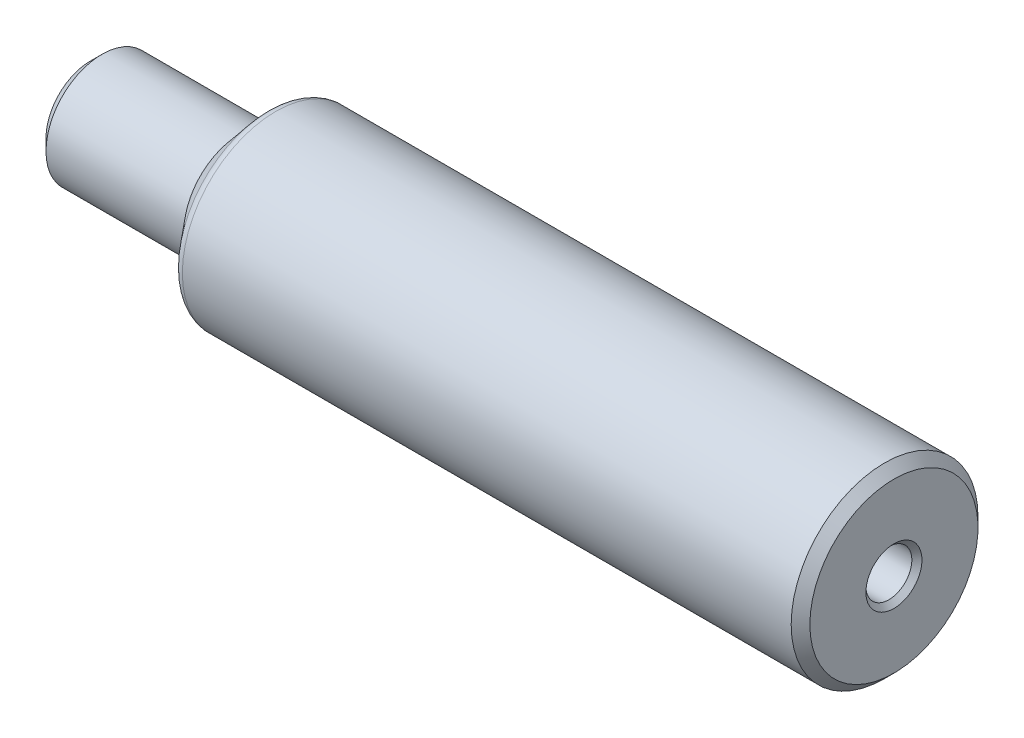
ISO-10303-21;
HEADER;
FILE_DESCRIPTION(('STEP AP214'),'2;1');
FILE_NAME('part.step','',(''),(''),'','','');
FILE_SCHEMA(('AUTOMOTIVE_DESIGN { 1 0 10303 214 1 1 1 1 }'));
ENDSEC;
DATA;
#1=APPLICATION_CONTEXT('core data for automotive mechanical design processes');
#2=APPLICATION_PROTOCOL_DEFINITION('international standard','automotive_design',2000,#1);
#3=PRODUCT_CONTEXT('',#1,'mechanical');
#4=PRODUCT('Part','Part','',(#3));
#5=PRODUCT_RELATED_PRODUCT_CATEGORY('part','',(#4));
#6=PRODUCT_DEFINITION_FORMATION('','',#4);
#7=PRODUCT_DEFINITION_CONTEXT('part definition',#1,'design');
#8=PRODUCT_DEFINITION('design','',#6,#7);
#9=PRODUCT_DEFINITION_SHAPE('','',#8);
#10=(LENGTH_UNIT() NAMED_UNIT(*) SI_UNIT(.MILLI.,.METRE.));
#11=(NAMED_UNIT(*) PLANE_ANGLE_UNIT() SI_UNIT($,.RADIAN.));
#12=(NAMED_UNIT(*) SI_UNIT($,.STERADIAN.) SOLID_ANGLE_UNIT());
#13=UNCERTAINTY_MEASURE_WITH_UNIT(LENGTH_MEASURE(1.E-05),#10,'distance_accuracy_value','');
#14=(GEOMETRIC_REPRESENTATION_CONTEXT(3) GLOBAL_UNCERTAINTY_ASSIGNED_CONTEXT((#13)) GLOBAL_UNIT_ASSIGNED_CONTEXT((#10,
#11,#12)) REPRESENTATION_CONTEXT('',''));
#15=CARTESIAN_POINT('',(0.,0.,0.));
#16=DIRECTION('',(0.,0.,1.));
#17=DIRECTION('',(1.,0.,0.));
#18=AXIS2_PLACEMENT_3D('',#15,#16,#17);
#19=CARTESIAN_POINT('',(35.,0.,0.));
#20=DIRECTION('',(-1.,0.,0.));
#21=DIRECTION('',(0.,0.,1.));
#22=AXIS2_PLACEMENT_3D('',#19,#20,#21);
#23=CYLINDRICAL_SURFACE('',#22,5.);
#24=CARTESIAN_POINT('',(1.91135309143204,0.,0.));
#25=DIRECTION('',(1.,0.,0.));
#26=DIRECTION('',(0.,0.,-1.));
#27=AXIS2_PLACEMENT_3D('',#24,#25,#26);
#28=CIRCLE('',#27,5.);
#29=CARTESIAN_POINT('',(1.91135309143204,0.,-5.));
#30=VERTEX_POINT('',#29);
#31=EDGE_CURVE('E11',#30,#30,#28,.T.);
#32=ORIENTED_EDGE('',*,*,#31,.T.);
#33=EDGE_LOOP('',(#32));
#34=FACE_BOUND('',#33,.T.);
#35=CARTESIAN_POINT('',(34.5,0.,0.));
#36=DIRECTION('',(-1.,0.,0.));
#37=DIRECTION('',(0.,0.,1.));
#38=AXIS2_PLACEMENT_3D('',#35,#36,#37);
#39=CIRCLE('',#38,5.);
#40=CARTESIAN_POINT('',(34.5,0.,5.));
#41=VERTEX_POINT('',#40);
#42=EDGE_CURVE('E82',#41,#41,#39,.T.);
#43=ORIENTED_EDGE('',*,*,#42,.T.);
#44=EDGE_LOOP('',(#43));
#45=FACE_BOUND('',#44,.T.);
#46=ADVANCED_FACE('F42',(#34,#45),#23,.T.);
#47=CARTESIAN_POINT('',(35.,0.,0.));
#48=DIRECTION('',(-1.,0.,0.));
#49=DIRECTION('',(0.,0.,1.));
#50=AXIS2_PLACEMENT_3D('',#47,#48,#49);
#51=CONICAL_SURFACE('',#50,4.5,0.785398163397448);
#52=ORIENTED_EDGE('',*,*,#42,.F.);
#53=EDGE_LOOP('',(#52));
#54=FACE_BOUND('',#53,.T.);
#55=CARTESIAN_POINT('',(35.,0.,0.));
#56=DIRECTION('',(-1.,0.,0.));
#57=DIRECTION('',(0.,0.,1.));
#58=AXIS2_PLACEMENT_3D('',#55,#56,#57);
#59=CIRCLE('',#58,4.5);
#60=CARTESIAN_POINT('',(35.,0.,4.5));
#61=VERTEX_POINT('',#60);
#62=EDGE_CURVE('E79',#61,#61,#59,.T.);
#63=ORIENTED_EDGE('',*,*,#62,.T.);
#64=EDGE_LOOP('',(#63));
#65=FACE_BOUND('',#64,.T.);
#66=ADVANCED_FACE('F100',(#54,#65),#51,.T.);
#67=CARTESIAN_POINT('',(35.,4.5,0.));
#68=DIRECTION('',(-1.,0.,0.));
#69=DIRECTION('',(0.,0.,1.));
#70=AXIS2_PLACEMENT_3D('',#67,#68,#69);
#71=PLANE('',#70);
#72=CARTESIAN_POINT('',(35.,0.,0.));
#73=DIRECTION('',(-1.,0.,0.));
#74=DIRECTION('',(0.,0.,1.));
#75=AXIS2_PLACEMENT_3D('',#72,#73,#74);
#76=CIRCLE('',#75,1.5);
#77=CARTESIAN_POINT('',(35.,0.,1.5));
#78=VERTEX_POINT('',#77);
#79=EDGE_CURVE('E66',#78,#78,#76,.T.);
#80=ORIENTED_EDGE('',*,*,#79,.T.);
#81=EDGE_LOOP('',(#80));
#82=FACE_BOUND('',#81,.T.);
#83=ORIENTED_EDGE('',*,*,#62,.F.);
#84=EDGE_LOOP('',(#83));
#85=FACE_BOUND('',#84,.T.);
#86=ADVANCED_FACE('F105',(#82,#85),#71,.F.);
#87=CARTESIAN_POINT('',(35.,0.,0.));
#88=DIRECTION('',(1.,0.,0.));
#89=DIRECTION('',(0.,0.,-1.));
#90=AXIS2_PLACEMENT_3D('',#87,#88,#89);
#91=CONICAL_SURFACE('',#90,1.5,0.785398163397449);
#92=CARTESIAN_POINT('',(34.7295,0.,0.));
#93=DIRECTION('',(-1.,0.,0.));
#94=DIRECTION('',(0.,0.,1.));
#95=AXIS2_PLACEMENT_3D('',#92,#93,#94);
#96=CIRCLE('',#95,1.2295);
#97=CARTESIAN_POINT('',(34.7295,0.,1.2295));
#98=VERTEX_POINT('',#97);
#99=EDGE_CURVE('E62',#98,#98,#96,.T.);
#100=ORIENTED_EDGE('',*,*,#99,.T.);
#101=EDGE_LOOP('',(#100));
#102=FACE_BOUND('',#101,.T.);
#103=ORIENTED_EDGE('',*,*,#79,.F.);
#104=EDGE_LOOP('',(#103));
#105=FACE_BOUND('',#104,.T.);
#106=ADVANCED_FACE('F112',(#102,#105),#91,.F.);
#107=CARTESIAN_POINT('',(35.,0.,0.));
#108=DIRECTION('',(-1.,0.,0.));
#109=DIRECTION('',(0.,0.,1.));
#110=AXIS2_PLACEMENT_3D('',#107,#108,#109);
#111=CYLINDRICAL_SURFACE('',#110,1.2295);
#112=CARTESIAN_POINT('',(21.209852155969,0.,0.));
#113=DIRECTION('',(-1.,0.,0.));
#114=DIRECTION('',(0.,0.,1.));
#115=AXIS2_PLACEMENT_3D('',#112,#113,#114);
#116=CIRCLE('',#115,1.2295);
#117=CARTESIAN_POINT('',(21.209852155969,0.,1.2295));
#118=VERTEX_POINT('',#117);
#119=EDGE_CURVE('E60',#118,#118,#116,.T.);
#120=ORIENTED_EDGE('',*,*,#119,.T.);
#121=EDGE_LOOP('',(#120));
#122=FACE_BOUND('',#121,.T.);
#123=ORIENTED_EDGE('',*,*,#99,.F.);
#124=EDGE_LOOP('',(#123));
#125=FACE_BOUND('',#124,.T.);
#126=ADVANCED_FACE('F56',(#122,#125),#111,.F.);
#127=CARTESIAN_POINT('',(21.209852155969,0.,0.));
#128=DIRECTION('',(1.,0.,0.));
#129=DIRECTION('',(0.,0.,-1.));
#130=AXIS2_PLACEMENT_3D('',#127,#128,#129);
#131=CONICAL_SURFACE('',#130,1.2295,1.04719755119638);
#132=CARTESIAN_POINT('',(20.5,0.,0.));
#133=VERTEX_POINT('',#132);
#134=VERTEX_LOOP('',#133);
#135=FACE_BOUND('',#134,.T.);
#136=ORIENTED_EDGE('',*,*,#119,.F.);
#137=EDGE_LOOP('',(#136));
#138=FACE_BOUND('',#137,.T.);
#139=ADVANCED_FACE('F52',(#135,#138),#131,.F.);
#140=CARTESIAN_POINT('',(0.,0.,0.));
#141=DIRECTION('',(1.,0.,0.));
#142=DIRECTION('',(0.,0.,-1.));
#143=AXIS2_PLACEMENT_3D('',#140,#141,#142);
#144=CONICAL_SURFACE('',#143,3.,0.872664625997171);
#145=CARTESIAN_POINT('',(1.52833086987255,0.,0.));
#146=DIRECTION('',(1.,0.,0.));
#147=DIRECTION('',(0.,0.,-1.));
#148=AXIS2_PLACEMENT_3D('',#145,#146,#147);
#149=CIRCLE('',#148,4.82139380484327);
#150=CARTESIAN_POINT('',(1.52833086987255,0.,-4.82139380484327));
#151=VERTEX_POINT('',#150);
#152=EDGE_CURVE('E49',#151,#151,#149,.F.);
#153=ORIENTED_EDGE('',*,*,#152,.T.);
#154=EDGE_LOOP('',(#153));
#155=FACE_BOUND('',#154,.T.);
#156=CARTESIAN_POINT('',(0.,0.,0.));
#157=DIRECTION('',(-1.,0.,0.));
#158=DIRECTION('',(0.,0.,1.));
#159=AXIS2_PLACEMENT_3D('',#156,#157,#158);
#160=CIRCLE('',#159,3.);
#161=CARTESIAN_POINT('',(0.,0.,3.));
#162=VERTEX_POINT('',#161);
#163=EDGE_CURVE('E63',#162,#162,#160,.T.);
#164=ORIENTED_EDGE('',*,*,#163,.F.);
#165=EDGE_LOOP('',(#164));
#166=FACE_BOUND('',#165,.T.);
#167=ADVANCED_FACE('F55',(#155,#166),#144,.T.);
#168=CARTESIAN_POINT('',(-8.,0.,0.));
#169=DIRECTION('',(1.,0.,0.));
#170=DIRECTION('',(0.,0.,-1.));
#171=AXIS2_PLACEMENT_3D('',#168,#169,#170);
#172=PLANE('',#171);
#173=CARTESIAN_POINT('',(-8.,0.,0.));
#174=DIRECTION('',(-1.,0.,0.));
#175=DIRECTION('',(0.,0.,1.));
#176=AXIS2_PLACEMENT_3D('',#173,#174,#175);
#177=CIRCLE('',#176,2.3865);
#178=CARTESIAN_POINT('',(-8.,0.,2.3865));
#179=VERTEX_POINT('',#178);
#180=EDGE_CURVE('E76',#179,#179,#177,.T.);
#181=ORIENTED_EDGE('',*,*,#180,.T.);
#182=EDGE_LOOP('',(#181));
#183=FACE_BOUND('',#182,.T.);
#184=ADVANCED_FACE('F114',(#183),#172,.F.);
#185=CARTESIAN_POINT('',(-7.3865,0.,0.));
#186=DIRECTION('',(1.,0.,0.));
#187=DIRECTION('',(0.,0.,-1.));
#188=AXIS2_PLACEMENT_3D('',#185,#186,#187);
#189=CONICAL_SURFACE('',#188,3.,0.785398163397448);
#190=ORIENTED_EDGE('',*,*,#180,.F.);
#191=EDGE_LOOP('',(#190));
#192=FACE_BOUND('',#191,.T.);
#193=CARTESIAN_POINT('',(-7.3865,0.,0.));
#194=DIRECTION('',(-1.,0.,0.));
#195=DIRECTION('',(0.,0.,1.));
#196=AXIS2_PLACEMENT_3D('',#193,#194,#195);
#197=CIRCLE('',#196,3.);
#198=CARTESIAN_POINT('',(-7.3865,0.,3.));
#199=VERTEX_POINT('',#198);
#200=EDGE_CURVE('E73',#199,#199,#197,.T.);
#201=ORIENTED_EDGE('',*,*,#200,.T.);
#202=EDGE_LOOP('',(#201));
#203=FACE_BOUND('',#202,.T.);
#204=ADVANCED_FACE('F95',(#192,#203),#189,.T.);
#205=CARTESIAN_POINT('',(0.,0.,0.));
#206=DIRECTION('',(-1.,0.,0.));
#207=DIRECTION('',(0.,0.,1.));
#208=AXIS2_PLACEMENT_3D('',#205,#206,#207);
#209=CYLINDRICAL_SURFACE('',#208,3.);
#210=ORIENTED_EDGE('',*,*,#200,.F.);
#211=EDGE_LOOP('',(#210));
#212=FACE_BOUND('',#211,.T.);
#213=ORIENTED_EDGE('',*,*,#163,.T.);
#214=EDGE_LOOP('',(#213));
#215=FACE_BOUND('',#214,.T.);
#216=ADVANCED_FACE('F90',(#212,#215),#209,.T.);
#217=CARTESIAN_POINT('',(1.91135309143204,0.,0.));
#218=DIRECTION('',(1.,0.,0.));
#219=DIRECTION('',(0.,0.,-1.));
#220=AXIS2_PLACEMENT_3D('',#217,#218,#219);
#221=TOROIDAL_SURFACE('',#220,4.5,0.5);
#222=ORIENTED_EDGE('',*,*,#31,.F.);
#223=EDGE_LOOP('',(#222));
#224=FACE_BOUND('',#223,.T.);
#225=ORIENTED_EDGE('',*,*,#152,.F.);
#226=EDGE_LOOP('',(#225));
#227=FACE_BOUND('',#226,.T.);
#228=ADVANCED_FACE('F44',(#224,#227),#221,.T.);
#229=CLOSED_SHELL('',(#46,#66,#86,#106,#126,#139,#167,#184,#204,#216,#228));
#230=MANIFOLD_SOLID_BREP('B2',#229);
#231=ADVANCED_BREP_SHAPE_REPRESENTATION('',(#18,#230),#14);
#232=SHAPE_DEFINITION_REPRESENTATION(#9,#231);
ENDSEC;
END-ISO-10303-21;
